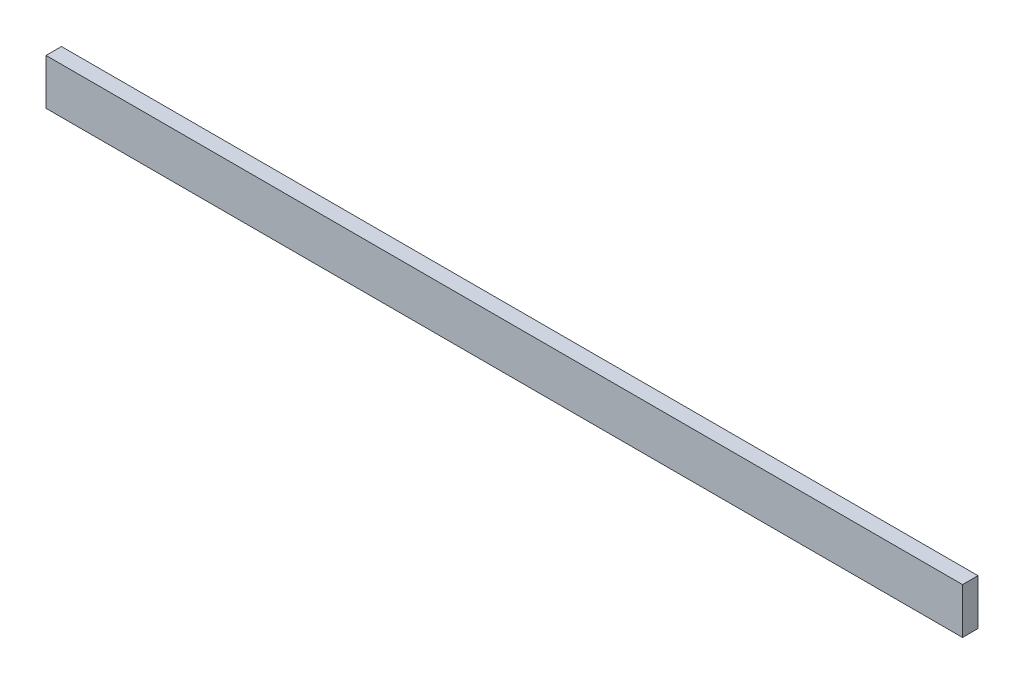
ISO-10303-21;
HEADER;
FILE_DESCRIPTION(('STEP AP214'),'2;1');
FILE_NAME('part.step','',(''),(''),'','','');
FILE_SCHEMA(('AUTOMOTIVE_DESIGN { 1 0 10303 214 1 1 1 1 }'));
ENDSEC;
DATA;
#1=APPLICATION_CONTEXT('core data for automotive mechanical design processes');
#2=APPLICATION_PROTOCOL_DEFINITION('international standard','automotive_design',2000,#1);
#3=PRODUCT_CONTEXT('',#1,'mechanical');
#4=PRODUCT('Part','Part','',(#3));
#5=PRODUCT_RELATED_PRODUCT_CATEGORY('part','',(#4));
#6=PRODUCT_DEFINITION_FORMATION('','',#4);
#7=PRODUCT_DEFINITION_CONTEXT('part definition',#1,'design');
#8=PRODUCT_DEFINITION('design','',#6,#7);
#9=PRODUCT_DEFINITION_SHAPE('','',#8);
#10=(LENGTH_UNIT() NAMED_UNIT(*) SI_UNIT(.MILLI.,.METRE.));
#11=(NAMED_UNIT(*) PLANE_ANGLE_UNIT() SI_UNIT($,.RADIAN.));
#12=(NAMED_UNIT(*) SI_UNIT($,.STERADIAN.) SOLID_ANGLE_UNIT());
#13=UNCERTAINTY_MEASURE_WITH_UNIT(LENGTH_MEASURE(1.E-05),#10,'distance_accuracy_value','');
#14=(GEOMETRIC_REPRESENTATION_CONTEXT(3) GLOBAL_UNCERTAINTY_ASSIGNED_CONTEXT((#13)) GLOBAL_UNIT_ASSIGNED_CONTEXT((#10,
#11,#12)) REPRESENTATION_CONTEXT('',''));
#15=CARTESIAN_POINT('',(0.,0.,0.));
#16=DIRECTION('',(0.,0.,1.));
#17=DIRECTION('',(1.,0.,0.));
#18=AXIS2_PLACEMENT_3D('',#15,#16,#17);
#19=CARTESIAN_POINT('',(0.,0.,27.));
#20=DIRECTION('',(1.,0.,0.));
#21=DIRECTION('',(0.,0.,-1.));
#22=AXIS2_PLACEMENT_3D('',#19,#20,#21);
#23=PLANE('',#22);
#24=DIRECTION('',(0.,-1.,0.));
#25=VECTOR('',#24,1.);
#26=CARTESIAN_POINT('',(0.,0.,0.));
#27=LINE('',#26,#25);
#28=CARTESIAN_POINT('',(0.,80.,0.));
#29=VERTEX_POINT('',#28);
#30=CARTESIAN_POINT('',(0.,0.,0.));
#31=VERTEX_POINT('',#30);
#32=EDGE_CURVE('E95',#29,#31,#27,.T.);
#33=ORIENTED_EDGE('',*,*,#32,.T.);
#34=DIRECTION('',(0.,0.,-1.));
#35=VECTOR('',#34,1.);
#36=CARTESIAN_POINT('',(0.,0.,27.));
#37=LINE('',#36,#35);
#38=CARTESIAN_POINT('',(0.,0.,27.));
#39=VERTEX_POINT('',#38);
#40=EDGE_CURVE('E11',#39,#31,#37,.T.);
#41=ORIENTED_EDGE('',*,*,#40,.F.);
#42=DIRECTION('',(0.,-1.,0.));
#43=VECTOR('',#42,1.);
#44=CARTESIAN_POINT('',(0.,0.,27.));
#45=LINE('',#44,#43);
#46=CARTESIAN_POINT('',(0.,80.,27.));
#47=VERTEX_POINT('',#46);
#48=EDGE_CURVE('E83',#47,#39,#45,.T.);
#49=ORIENTED_EDGE('',*,*,#48,.F.);
#50=DIRECTION('',(0.,0.,-1.));
#51=VECTOR('',#50,1.);
#52=CARTESIAN_POINT('',(0.,80.,27.));
#53=LINE('',#52,#51);
#54=EDGE_CURVE('E91',#47,#29,#53,.T.);
#55=ORIENTED_EDGE('',*,*,#54,.T.);
#56=EDGE_LOOP('',(#33,#41,#49,#55));
#57=FACE_BOUND('',#56,.T.);
#58=ADVANCED_FACE('F32',(#57),#23,.F.);
#59=CARTESIAN_POINT('',(0.,0.,27.));
#60=DIRECTION('',(0.,1.,0.));
#61=DIRECTION('',(0.,0.,1.));
#62=AXIS2_PLACEMENT_3D('',#59,#60,#61);
#63=PLANE('',#62);
#64=DIRECTION('',(1.,0.,0.));
#65=VECTOR('',#64,1.);
#66=CARTESIAN_POINT('',(0.,0.,0.));
#67=LINE('',#66,#65);
#68=CARTESIAN_POINT('',(1600.,0.,0.));
#69=VERTEX_POINT('',#68);
#70=EDGE_CURVE('E87',#31,#69,#67,.T.);
#71=ORIENTED_EDGE('',*,*,#70,.T.);
#72=DIRECTION('',(0.,0.,-1.));
#73=VECTOR('',#72,1.);
#74=CARTESIAN_POINT('',(1600.,0.,27.));
#75=LINE('',#74,#73);
#76=CARTESIAN_POINT('',(1600.,0.,27.));
#77=VERTEX_POINT('',#76);
#78=EDGE_CURVE('E40',#77,#69,#75,.T.);
#79=ORIENTED_EDGE('',*,*,#78,.F.);
#80=DIRECTION('',(1.,0.,0.));
#81=VECTOR('',#80,1.);
#82=CARTESIAN_POINT('',(0.,0.,27.));
#83=LINE('',#82,#81);
#84=EDGE_CURVE('E78',#39,#77,#83,.T.);
#85=ORIENTED_EDGE('',*,*,#84,.F.);
#86=ORIENTED_EDGE('',*,*,#40,.T.);
#87=EDGE_LOOP('',(#71,#79,#85,#86));
#88=FACE_BOUND('',#87,.T.);
#89=ADVANCED_FACE('F86',(#88),#63,.F.);
#90=CARTESIAN_POINT('',(1600.,0.,27.));
#91=DIRECTION('',(-1.,0.,0.));
#92=DIRECTION('',(0.,0.,1.));
#93=AXIS2_PLACEMENT_3D('',#90,#91,#92);
#94=PLANE('',#93);
#95=DIRECTION('',(0.,1.,0.));
#96=VECTOR('',#95,1.);
#97=CARTESIAN_POINT('',(1600.,0.,0.));
#98=LINE('',#97,#96);
#99=CARTESIAN_POINT('',(1600.,80.,0.));
#100=VERTEX_POINT('',#99);
#101=EDGE_CURVE('E65',#69,#100,#98,.T.);
#102=ORIENTED_EDGE('',*,*,#101,.T.);
#103=DIRECTION('',(0.,0.,-1.));
#104=VECTOR('',#103,1.);
#105=CARTESIAN_POINT('',(1600.,80.,27.));
#106=LINE('',#105,#104);
#107=CARTESIAN_POINT('',(1600.,80.,27.));
#108=VERTEX_POINT('',#107);
#109=EDGE_CURVE('E88',#108,#100,#106,.T.);
#110=ORIENTED_EDGE('',*,*,#109,.F.);
#111=DIRECTION('',(0.,1.,0.));
#112=VECTOR('',#111,1.);
#113=CARTESIAN_POINT('',(1600.,0.,27.));
#114=LINE('',#113,#112);
#115=EDGE_CURVE('E81',#77,#108,#114,.T.);
#116=ORIENTED_EDGE('',*,*,#115,.F.);
#117=ORIENTED_EDGE('',*,*,#78,.T.);
#118=EDGE_LOOP('',(#102,#110,#116,#117));
#119=FACE_BOUND('',#118,.T.);
#120=ADVANCED_FACE('F89',(#119),#94,.F.);
#121=CARTESIAN_POINT('',(0.,80.,27.));
#122=DIRECTION('',(0.,-1.,0.));
#123=DIRECTION('',(0.,0.,-1.));
#124=AXIS2_PLACEMENT_3D('',#121,#122,#123);
#125=PLANE('',#124);
#126=DIRECTION('',(-1.,0.,0.));
#127=VECTOR('',#126,1.);
#128=CARTESIAN_POINT('',(0.,80.,0.));
#129=LINE('',#128,#127);
#130=EDGE_CURVE('E71',#100,#29,#129,.T.);
#131=ORIENTED_EDGE('',*,*,#130,.T.);
#132=ORIENTED_EDGE('',*,*,#54,.F.);
#133=DIRECTION('',(-1.,0.,0.));
#134=VECTOR('',#133,1.);
#135=CARTESIAN_POINT('',(0.,80.,27.));
#136=LINE('',#135,#134);
#137=EDGE_CURVE('E48',#108,#47,#136,.T.);
#138=ORIENTED_EDGE('',*,*,#137,.F.);
#139=ORIENTED_EDGE('',*,*,#109,.T.);
#140=EDGE_LOOP('',(#131,#132,#138,#139));
#141=FACE_BOUND('',#140,.T.);
#142=ADVANCED_FACE('F102',(#141),#125,.F.);
#143=CARTESIAN_POINT('',(0.,0.,27.));
#144=DIRECTION('',(0.,0.,-1.));
#145=DIRECTION('',(-1.,0.,0.));
#146=AXIS2_PLACEMENT_3D('',#143,#144,#145);
#147=PLANE('',#146);
#148=ORIENTED_EDGE('',*,*,#48,.T.);
#149=ORIENTED_EDGE('',*,*,#84,.T.);
#150=ORIENTED_EDGE('',*,*,#115,.T.);
#151=ORIENTED_EDGE('',*,*,#137,.T.);
#152=EDGE_LOOP('',(#148,#149,#150,#151));
#153=FACE_BOUND('',#152,.T.);
#154=ADVANCED_FACE('F79',(#153),#147,.F.);
#155=CARTESIAN_POINT('',(0.,0.,0.));
#156=DIRECTION('',(0.,0.,-1.));
#157=DIRECTION('',(-1.,0.,0.));
#158=AXIS2_PLACEMENT_3D('',#155,#156,#157);
#159=PLANE('',#158);
#160=ORIENTED_EDGE('',*,*,#32,.F.);
#161=ORIENTED_EDGE('',*,*,#130,.F.);
#162=ORIENTED_EDGE('',*,*,#101,.F.);
#163=ORIENTED_EDGE('',*,*,#70,.F.);
#164=EDGE_LOOP('',(#160,#161,#162,#163));
#165=FACE_BOUND('',#164,.T.);
#166=ADVANCED_FACE('F105',(#165),#159,.T.);
#167=CLOSED_SHELL('',(#58,#89,#120,#142,#154,#166));
#168=MANIFOLD_SOLID_BREP('B2',#167);
#169=ADVANCED_BREP_SHAPE_REPRESENTATION('',(#18,#168),#14);
#170=SHAPE_DEFINITION_REPRESENTATION(#9,#169);
ENDSEC;
END-ISO-10303-21;
